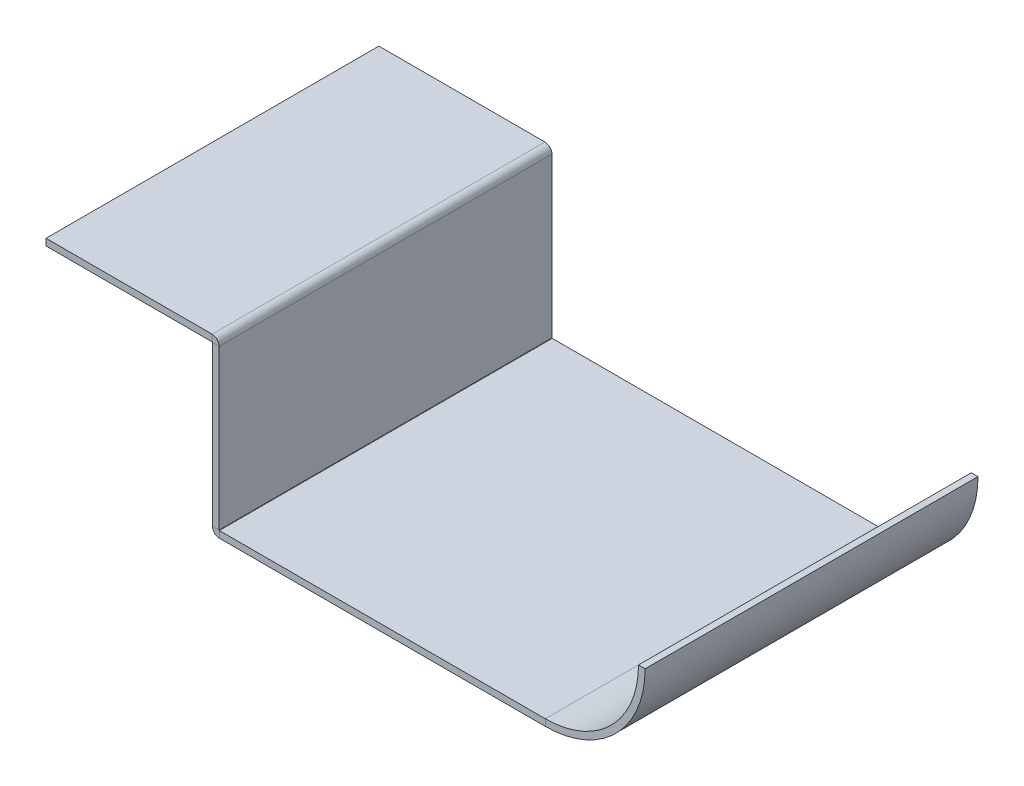
ISO-10303-21;
HEADER;
FILE_DESCRIPTION(('STEP AP214'),'2;1');
FILE_NAME('part.step','',(''),(''),'','','');
FILE_SCHEMA(('AUTOMOTIVE_DESIGN { 1 0 10303 214 1 1 1 1 }'));
ENDSEC;
DATA;
#1=APPLICATION_CONTEXT('core data for automotive mechanical design processes');
#2=APPLICATION_PROTOCOL_DEFINITION('international standard','automotive_design',2000,#1);
#3=PRODUCT_CONTEXT('',#1,'mechanical');
#4=PRODUCT('Part','Part','',(#3));
#5=PRODUCT_RELATED_PRODUCT_CATEGORY('part','',(#4));
#6=PRODUCT_DEFINITION_FORMATION('','',#4);
#7=PRODUCT_DEFINITION_CONTEXT('part definition',#1,'design');
#8=PRODUCT_DEFINITION('design','',#6,#7);
#9=PRODUCT_DEFINITION_SHAPE('','',#8);
#10=(LENGTH_UNIT() NAMED_UNIT(*) SI_UNIT(.MILLI.,.METRE.));
#11=(NAMED_UNIT(*) PLANE_ANGLE_UNIT() SI_UNIT($,.RADIAN.));
#12=(NAMED_UNIT(*) SI_UNIT($,.STERADIAN.) SOLID_ANGLE_UNIT());
#13=UNCERTAINTY_MEASURE_WITH_UNIT(LENGTH_MEASURE(1.E-05),#10,'distance_accuracy_value','');
#14=(GEOMETRIC_REPRESENTATION_CONTEXT(3) GLOBAL_UNCERTAINTY_ASSIGNED_CONTEXT((#13)) GLOBAL_UNIT_ASSIGNED_CONTEXT((#10,
#11,#12)) REPRESENTATION_CONTEXT('',''));
#15=CARTESIAN_POINT('',(0.,0.,0.));
#16=DIRECTION('',(0.,0.,1.));
#17=DIRECTION('',(1.,0.,0.));
#18=AXIS2_PLACEMENT_3D('',#15,#16,#17);
#19=CARTESIAN_POINT('',(100.,2.,-100.));
#20=DIRECTION('',(0.,0.,-1.));
#21=DIRECTION('',(-1.,0.,0.));
#22=AXIS2_PLACEMENT_3D('',#19,#20,#21);
#23=PLANE('',#22);
#24=DIRECTION('',(0.,-1.,0.));
#25=VECTOR('',#24,1.);
#26=CARTESIAN_POINT('',(100.,2.,-100.));
#27=LINE('',#26,#25);
#28=CARTESIAN_POINT('',(100.,2.,-100.));
#29=VERTEX_POINT('',#28);
#30=CARTESIAN_POINT('',(100.,0.,-100.));
#31=VERTEX_POINT('',#30);
#32=EDGE_CURVE('E11',#29,#31,#27,.T.);
#33=ORIENTED_EDGE('',*,*,#32,.F.);
#34=CARTESIAN_POINT('',(100.,30.,-100.));
#35=DIRECTION('',(0.,0.,1.));
#36=DIRECTION('',(1.,0.,0.));
#37=AXIS2_PLACEMENT_3D('',#34,#35,#36);
#38=CIRCLE('',#37,28.);
#39=CARTESIAN_POINT('',(128.,30.,-100.));
#40=VERTEX_POINT('',#39);
#41=EDGE_CURVE('E198',#40,#29,#38,.F.);
#42=ORIENTED_EDGE('',*,*,#41,.F.);
#43=DIRECTION('',(1.,0.,0.));
#44=VECTOR('',#43,1.);
#45=CARTESIAN_POINT('',(128.,30.,-100.));
#46=LINE('',#45,#44);
#47=CARTESIAN_POINT('',(130.,30.,-100.));
#48=VERTEX_POINT('',#47);
#49=EDGE_CURVE('E345',#40,#48,#46,.T.);
#50=ORIENTED_EDGE('',*,*,#49,.T.);
#51=CARTESIAN_POINT('',(100.,30.,-100.));
#52=DIRECTION('',(0.,0.,-1.));
#53=DIRECTION('',(1.,0.,0.));
#54=AXIS2_PLACEMENT_3D('',#51,#52,#53);
#55=CIRCLE('',#54,30.);
#56=EDGE_CURVE('E341',#48,#31,#55,.T.);
#57=ORIENTED_EDGE('',*,*,#56,.T.);
#58=EDGE_LOOP('',(#33,#42,#50,#57));
#59=FACE_BOUND('',#58,.T.);
#60=ADVANCED_FACE('F41',(#59),#23,.T.);
#61=CARTESIAN_POINT('',(100.,0.,0.));
#62=DIRECTION('',(0.,0.,1.));
#63=DIRECTION('',(1.,0.,0.));
#64=AXIS2_PLACEMENT_3D('',#61,#62,#63);
#65=PLANE('',#64);
#66=DIRECTION('',(0.,1.,0.));
#67=VECTOR('',#66,1.);
#68=CARTESIAN_POINT('',(100.,0.,0.));
#69=LINE('',#68,#67);
#70=CARTESIAN_POINT('',(100.,0.,0.));
#71=VERTEX_POINT('',#70);
#72=CARTESIAN_POINT('',(100.,2.,0.));
#73=VERTEX_POINT('',#72);
#74=EDGE_CURVE('E50',#71,#73,#69,.T.);
#75=ORIENTED_EDGE('',*,*,#74,.F.);
#76=CARTESIAN_POINT('',(100.,30.,0.));
#77=DIRECTION('',(0.,0.,-1.));
#78=DIRECTION('',(1.,0.,0.));
#79=AXIS2_PLACEMENT_3D('',#76,#77,#78);
#80=CIRCLE('',#79,30.);
#81=CARTESIAN_POINT('',(130.,30.,0.));
#82=VERTEX_POINT('',#81);
#83=EDGE_CURVE('E232',#82,#71,#80,.T.);
#84=ORIENTED_EDGE('',*,*,#83,.F.);
#85=DIRECTION('',(1.,0.,0.));
#86=VECTOR('',#85,1.);
#87=CARTESIAN_POINT('',(128.,30.,0.));
#88=LINE('',#87,#86);
#89=CARTESIAN_POINT('',(128.,30.,0.));
#90=VERTEX_POINT('',#89);
#91=EDGE_CURVE('E236',#90,#82,#88,.T.);
#92=ORIENTED_EDGE('',*,*,#91,.F.);
#93=CARTESIAN_POINT('',(100.,30.,0.));
#94=DIRECTION('',(0.,0.,1.));
#95=DIRECTION('',(1.,0.,0.));
#96=AXIS2_PLACEMENT_3D('',#93,#94,#95);
#97=CIRCLE('',#96,28.);
#98=EDGE_CURVE('E239',#90,#73,#97,.F.);
#99=ORIENTED_EDGE('',*,*,#98,.T.);
#100=EDGE_LOOP('',(#75,#84,#92,#99));
#101=FACE_BOUND('',#100,.T.);
#102=ADVANCED_FACE('F331',(#101),#65,.T.);
#103=CARTESIAN_POINT('',(2.1,0.,-100.));
#104=DIRECTION('',(0.,0.,-1.));
#105=DIRECTION('',(-1.,0.,0.));
#106=AXIS2_PLACEMENT_3D('',#103,#104,#105);
#107=PLANE('',#106);
#108=DIRECTION('',(0.,1.,0.));
#109=VECTOR('',#108,1.);
#110=CARTESIAN_POINT('',(2.1,0.,-100.));
#111=LINE('',#110,#109);
#112=CARTESIAN_POINT('',(2.1,0.,-100.));
#113=VERTEX_POINT('',#112);
#114=CARTESIAN_POINT('',(2.1,2.,-100.));
#115=VERTEX_POINT('',#114);
#116=EDGE_CURVE('E166',#113,#115,#111,.T.);
#117=ORIENTED_EDGE('',*,*,#116,.F.);
#118=CARTESIAN_POINT('',(2.1,2.1,-100.));
#119=DIRECTION('',(0.,0.,1.));
#120=DIRECTION('',(1.,0.,0.));
#121=AXIS2_PLACEMENT_3D('',#118,#119,#120);
#122=CIRCLE('',#121,2.1);
#123=CARTESIAN_POINT('',(0.,2.1,-100.));
#124=VERTEX_POINT('',#123);
#125=EDGE_CURVE('E160',#113,#124,#122,.F.);
#126=ORIENTED_EDGE('',*,*,#125,.T.);
#127=DIRECTION('',(-1.,0.,0.));
#128=VECTOR('',#127,1.);
#129=CARTESIAN_POINT('',(2.,2.1,-100.));
#130=LINE('',#129,#128);
#131=CARTESIAN_POINT('',(2.,2.1,-100.));
#132=VERTEX_POINT('',#131);
#133=EDGE_CURVE('E153',#132,#124,#130,.T.);
#134=ORIENTED_EDGE('',*,*,#133,.F.);
#135=CARTESIAN_POINT('',(2.1,2.1,-100.));
#136=DIRECTION('',(0.,0.,1.));
#137=DIRECTION('',(1.,0.,0.));
#138=AXIS2_PLACEMENT_3D('',#135,#136,#137);
#139=CIRCLE('',#138,0.0999999999999998);
#140=EDGE_CURVE('E157',#115,#132,#139,.F.);
#141=ORIENTED_EDGE('',*,*,#140,.F.);
#142=EDGE_LOOP('',(#117,#126,#134,#141));
#143=FACE_BOUND('',#142,.T.);
#144=ADVANCED_FACE('F155',(#143),#107,.T.);
#145=CARTESIAN_POINT('',(2.,2.1,-100.));
#146=DIRECTION('',(0.,0.,-1.));
#147=DIRECTION('',(-1.,0.,0.));
#148=AXIS2_PLACEMENT_3D('',#145,#146,#147);
#149=PLANE('',#148);
#150=DIRECTION('',(-1.,0.,0.));
#151=VECTOR('',#150,1.);
#152=CARTESIAN_POINT('',(0.,0.,-100.));
#153=LINE('',#152,#151);
#154=EDGE_CURVE('E346',#31,#113,#153,.T.);
#155=ORIENTED_EDGE('',*,*,#154,.T.);
#156=ORIENTED_EDGE('',*,*,#116,.T.);
#157=DIRECTION('',(1.,0.,0.));
#158=VECTOR('',#157,1.);
#159=CARTESIAN_POINT('',(0.,2.,-100.));
#160=LINE('',#159,#158);
#161=EDGE_CURVE('E195',#29,#115,#160,.F.);
#162=ORIENTED_EDGE('',*,*,#161,.F.);
#163=ORIENTED_EDGE('',*,*,#32,.T.);
#164=EDGE_LOOP('',(#155,#156,#162,#163));
#165=FACE_BOUND('',#164,.T.);
#166=ADVANCED_FACE('F409',(#165),#149,.T.);
#167=CARTESIAN_POINT('',(0.,2.1,0.));
#168=DIRECTION('',(0.,0.,1.));
#169=DIRECTION('',(1.,0.,0.));
#170=AXIS2_PLACEMENT_3D('',#167,#168,#169);
#171=PLANE('',#170);
#172=DIRECTION('',(1.,0.,0.));
#173=VECTOR('',#172,1.);
#174=CARTESIAN_POINT('',(0.,2.1,0.));
#175=LINE('',#174,#173);
#176=CARTESIAN_POINT('',(0.,2.1,0.));
#177=VERTEX_POINT('',#176);
#178=CARTESIAN_POINT('',(2.,2.1,0.));
#179=VERTEX_POINT('',#178);
#180=EDGE_CURVE('E167',#177,#179,#175,.T.);
#181=ORIENTED_EDGE('',*,*,#180,.F.);
#182=CARTESIAN_POINT('',(2.1,2.1,0.));
#183=DIRECTION('',(0.,0.,1.));
#184=DIRECTION('',(1.,0.,0.));
#185=AXIS2_PLACEMENT_3D('',#182,#183,#184);
#186=CIRCLE('',#185,2.1);
#187=CARTESIAN_POINT('',(2.1,0.,0.));
#188=VERTEX_POINT('',#187);
#189=EDGE_CURVE('E224',#188,#177,#186,.F.);
#190=ORIENTED_EDGE('',*,*,#189,.F.);
#191=DIRECTION('',(0.,-1.,0.));
#192=VECTOR('',#191,1.);
#193=CARTESIAN_POINT('',(2.1,2.,0.));
#194=LINE('',#193,#192);
#195=CARTESIAN_POINT('',(2.1,2.,0.));
#196=VERTEX_POINT('',#195);
#197=EDGE_CURVE('E308',#196,#188,#194,.T.);
#198=ORIENTED_EDGE('',*,*,#197,.F.);
#199=CARTESIAN_POINT('',(2.1,2.1,0.));
#200=DIRECTION('',(0.,0.,1.));
#201=DIRECTION('',(1.,0.,0.));
#202=AXIS2_PLACEMENT_3D('',#199,#200,#201);
#203=CIRCLE('',#202,0.0999999999999998);
#204=EDGE_CURVE('E247',#196,#179,#203,.F.);
#205=ORIENTED_EDGE('',*,*,#204,.T.);
#206=EDGE_LOOP('',(#181,#190,#198,#205));
#207=FACE_BOUND('',#206,.T.);
#208=ADVANCED_FACE('F419',(#207),#171,.T.);
#209=CARTESIAN_POINT('',(2.1,2.,0.));
#210=DIRECTION('',(0.,0.,1.));
#211=DIRECTION('',(1.,0.,0.));
#212=AXIS2_PLACEMENT_3D('',#209,#210,#211);
#213=PLANE('',#212);
#214=DIRECTION('',(0.,1.,0.));
#215=VECTOR('',#214,1.);
#216=CARTESIAN_POINT('',(0.,50.,0.));
#217=LINE('',#216,#215);
#218=CARTESIAN_POINT('',(0.,49.9,0.));
#219=VERTEX_POINT('',#218);
#220=EDGE_CURVE('E220',#177,#219,#217,.T.);
#221=ORIENTED_EDGE('',*,*,#220,.F.);
#222=ORIENTED_EDGE('',*,*,#180,.T.);
#223=DIRECTION('',(0.,1.,0.));
#224=VECTOR('',#223,1.);
#225=CARTESIAN_POINT('',(2.,50.,0.));
#226=LINE('',#225,#224);
#227=CARTESIAN_POINT('',(2.,49.9,0.));
#228=VERTEX_POINT('',#227);
#229=EDGE_CURVE('E177',#179,#228,#226,.T.);
#230=ORIENTED_EDGE('',*,*,#229,.T.);
#231=DIRECTION('',(-1.,0.,0.));
#232=VECTOR('',#231,1.);
#233=CARTESIAN_POINT('',(2.,49.9,0.));
#234=LINE('',#233,#232);
#235=EDGE_CURVE('E105',#228,#219,#234,.T.);
#236=ORIENTED_EDGE('',*,*,#235,.T.);
#237=EDGE_LOOP('',(#221,#222,#230,#236));
#238=FACE_BOUND('',#237,.T.);
#239=ADVANCED_FACE('F417',(#238),#213,.T.);
#240=CARTESIAN_POINT('',(0.,49.9,-100.));
#241=DIRECTION('',(0.,0.,-1.));
#242=DIRECTION('',(-1.,0.,0.));
#243=AXIS2_PLACEMENT_3D('',#240,#241,#242);
#244=PLANE('',#243);
#245=DIRECTION('',(1.,0.,0.));
#246=VECTOR('',#245,1.);
#247=CARTESIAN_POINT('',(0.,49.9,-100.));
#248=LINE('',#247,#246);
#249=CARTESIAN_POINT('',(0.,49.9,-100.));
#250=VERTEX_POINT('',#249);
#251=CARTESIAN_POINT('',(2.,49.9,-100.));
#252=VERTEX_POINT('',#251);
#253=EDGE_CURVE('E186',#250,#252,#248,.T.);
#254=ORIENTED_EDGE('',*,*,#253,.F.);
#255=CARTESIAN_POINT('',(-0.0999999999999987,49.9,-100.));
#256=DIRECTION('',(0.,0.,-1.));
#257=DIRECTION('',(-1.,0.,0.));
#258=AXIS2_PLACEMENT_3D('',#255,#256,#257);
#259=CIRCLE('',#258,0.1);
#260=CARTESIAN_POINT('',(-0.0999999999999987,50.,-100.));
#261=VERTEX_POINT('',#260);
#262=EDGE_CURVE('E360',#250,#261,#259,.F.);
#263=ORIENTED_EDGE('',*,*,#262,.T.);
#264=DIRECTION('',(0.,-1.,0.));
#265=VECTOR('',#264,1.);
#266=CARTESIAN_POINT('',(-0.099999999999999,52.,-100.));
#267=LINE('',#266,#265);
#268=CARTESIAN_POINT('',(-0.099999999999999,52.,-100.));
#269=VERTEX_POINT('',#268);
#270=EDGE_CURVE('E58',#269,#261,#267,.T.);
#271=ORIENTED_EDGE('',*,*,#270,.F.);
#272=CARTESIAN_POINT('',(-0.0999999999999987,49.9,-100.));
#273=DIRECTION('',(0.,0.,1.));
#274=DIRECTION('',(1.,0.,0.));
#275=AXIS2_PLACEMENT_3D('',#272,#273,#274);
#276=CIRCLE('',#275,2.1);
#277=EDGE_CURVE('E189',#252,#269,#276,.T.);
#278=ORIENTED_EDGE('',*,*,#277,.F.);
#279=EDGE_LOOP('',(#254,#263,#271,#278));
#280=FACE_BOUND('',#279,.T.);
#281=ADVANCED_FACE('F377',(#280),#244,.T.);
#282=CARTESIAN_POINT('',(-0.099999999999999,52.,-100.));
#283=DIRECTION('',(0.,0.,-1.));
#284=DIRECTION('',(-1.,0.,0.));
#285=AXIS2_PLACEMENT_3D('',#282,#283,#284);
#286=PLANE('',#285);
#287=DIRECTION('',(0.,1.,0.));
#288=VECTOR('',#287,1.);
#289=CARTESIAN_POINT('',(0.,50.,-100.));
#290=LINE('',#289,#288);
#291=EDGE_CURVE('E357',#124,#250,#290,.T.);
#292=ORIENTED_EDGE('',*,*,#291,.T.);
#293=ORIENTED_EDGE('',*,*,#253,.T.);
#294=DIRECTION('',(0.,1.,0.));
#295=VECTOR('',#294,1.);
#296=CARTESIAN_POINT('',(2.,50.,-100.));
#297=LINE('',#296,#295);
#298=EDGE_CURVE('E175',#132,#252,#297,.T.);
#299=ORIENTED_EDGE('',*,*,#298,.F.);
#300=ORIENTED_EDGE('',*,*,#133,.T.);
#301=EDGE_LOOP('',(#292,#293,#299,#300));
#302=FACE_BOUND('',#301,.T.);
#303=ADVANCED_FACE('F185',(#302),#286,.T.);
#304=CARTESIAN_POINT('',(-0.0999999999999987,50.,0.));
#305=DIRECTION('',(0.,0.,1.));
#306=DIRECTION('',(1.,0.,0.));
#307=AXIS2_PLACEMENT_3D('',#304,#305,#306);
#308=PLANE('',#307);
#309=DIRECTION('',(0.,1.,0.));
#310=VECTOR('',#309,1.);
#311=CARTESIAN_POINT('',(-0.0999999999999987,50.,0.));
#312=LINE('',#311,#310);
#313=CARTESIAN_POINT('',(-0.0999999999999987,50.,0.));
#314=VERTEX_POINT('',#313);
#315=CARTESIAN_POINT('',(-0.099999999999999,52.,0.));
#316=VERTEX_POINT('',#315);
#317=EDGE_CURVE('E112',#314,#316,#312,.T.);
#318=ORIENTED_EDGE('',*,*,#317,.F.);
#319=CARTESIAN_POINT('',(-0.0999999999999987,49.9,0.));
#320=DIRECTION('',(0.,0.,-1.));
#321=DIRECTION('',(-1.,0.,0.));
#322=AXIS2_PLACEMENT_3D('',#319,#320,#321);
#323=CIRCLE('',#322,0.1);
#324=EDGE_CURVE('E216',#219,#314,#323,.F.);
#325=ORIENTED_EDGE('',*,*,#324,.F.);
#326=ORIENTED_EDGE('',*,*,#235,.F.);
#327=CARTESIAN_POINT('',(-0.0999999999999987,49.9,0.));
#328=DIRECTION('',(0.,0.,1.));
#329=DIRECTION('',(1.,0.,0.));
#330=AXIS2_PLACEMENT_3D('',#327,#328,#329);
#331=CIRCLE('',#330,2.1);
#332=EDGE_CURVE('E252',#228,#316,#331,.T.);
#333=ORIENTED_EDGE('',*,*,#332,.T.);
#334=EDGE_LOOP('',(#318,#325,#326,#333));
#335=FACE_BOUND('',#334,.T.);
#336=ADVANCED_FACE('F395',(#335),#308,.T.);
#337=CARTESIAN_POINT('',(2.,49.9,0.));
#338=DIRECTION('',(0.,0.,1.));
#339=DIRECTION('',(1.,0.,0.));
#340=AXIS2_PLACEMENT_3D('',#337,#338,#339);
#341=PLANE('',#340);
#342=DIRECTION('',(-1.,0.,0.));
#343=VECTOR('',#342,1.);
#344=CARTESIAN_POINT('',(0.,50.,0.));
#345=LINE('',#344,#343);
#346=CARTESIAN_POINT('',(-50.,50.,0.));
#347=VERTEX_POINT('',#346);
#348=EDGE_CURVE('E213',#314,#347,#345,.T.);
#349=ORIENTED_EDGE('',*,*,#348,.F.);
#350=ORIENTED_EDGE('',*,*,#317,.T.);
#351=DIRECTION('',(-1.,0.,0.));
#352=VECTOR('',#351,1.);
#353=CARTESIAN_POINT('',(0.,52.,0.));
#354=LINE('',#353,#352);
#355=CARTESIAN_POINT('',(-50.,52.,0.));
#356=VERTEX_POINT('',#355);
#357=EDGE_CURVE('E206',#316,#356,#354,.T.);
#358=ORIENTED_EDGE('',*,*,#357,.T.);
#359=DIRECTION('',(0.,1.,0.));
#360=VECTOR('',#359,1.);
#361=CARTESIAN_POINT('',(-50.,50.,0.));
#362=LINE('',#361,#360);
#363=EDGE_CURVE('E209',#347,#356,#362,.T.);
#364=ORIENTED_EDGE('',*,*,#363,.F.);
#365=EDGE_LOOP('',(#349,#350,#358,#364));
#366=FACE_BOUND('',#365,.T.);
#367=ADVANCED_FACE('F394',(#366),#341,.T.);
#368=CARTESIAN_POINT('',(0.,52.,-100.));
#369=DIRECTION('',(0.,1.,0.));
#370=DIRECTION('',(-1.,0.,0.));
#371=AXIS2_PLACEMENT_3D('',#368,#369,#370);
#372=PLANE('',#371);
#373=ORIENTED_EDGE('',*,*,#357,.F.);
#374=DIRECTION('',(0.,0.,1.));
#375=VECTOR('',#374,1.);
#376=CARTESIAN_POINT('',(-0.099999999999999,52.,-100.));
#377=LINE('',#376,#375);
#378=EDGE_CURVE('E256',#269,#316,#377,.T.);
#379=ORIENTED_EDGE('',*,*,#378,.F.);
#380=DIRECTION('',(-1.,0.,0.));
#381=VECTOR('',#380,1.);
#382=CARTESIAN_POINT('',(0.,52.,-100.));
#383=LINE('',#382,#381);
#384=CARTESIAN_POINT('',(-50.,52.,-100.));
#385=VERTEX_POINT('',#384);
#386=EDGE_CURVE('E255',#269,#385,#383,.T.);
#387=ORIENTED_EDGE('',*,*,#386,.T.);
#388=DIRECTION('',(0.,0.,1.));
#389=VECTOR('',#388,1.);
#390=CARTESIAN_POINT('',(-50.,52.,-100.));
#391=LINE('',#390,#389);
#392=EDGE_CURVE('E205',#385,#356,#391,.T.);
#393=ORIENTED_EDGE('',*,*,#392,.T.);
#394=EDGE_LOOP('',(#373,#379,#387,#393));
#395=FACE_BOUND('',#394,.T.);
#396=ADVANCED_FACE('F372',(#395),#372,.T.);
#397=CARTESIAN_POINT('',(-0.0999999999999987,49.9,-100.));
#398=DIRECTION('',(0.,0.,1.));
#399=DIRECTION('',(1.,0.,0.));
#400=AXIS2_PLACEMENT_3D('',#397,#398,#399);
#401=CYLINDRICAL_SURFACE('',#400,2.1);
#402=ORIENTED_EDGE('',*,*,#332,.F.);
#403=DIRECTION('',(0.,0.,1.));
#404=VECTOR('',#403,1.);
#405=CARTESIAN_POINT('',(2.,49.9,-100.));
#406=LINE('',#405,#404);
#407=EDGE_CURVE('E182',#252,#228,#406,.T.);
#408=ORIENTED_EDGE('',*,*,#407,.F.);
#409=ORIENTED_EDGE('',*,*,#277,.T.);
#410=ORIENTED_EDGE('',*,*,#378,.T.);
#411=EDGE_LOOP('',(#402,#408,#409,#410));
#412=FACE_BOUND('',#411,.T.);
#413=ADVANCED_FACE('F376',(#412),#401,.T.);
#414=CARTESIAN_POINT('',(2.,50.,-100.));
#415=DIRECTION('',(1.,0.,0.));
#416=DIRECTION('',(0.,1.,0.));
#417=AXIS2_PLACEMENT_3D('',#414,#415,#416);
#418=PLANE('',#417);
#419=ORIENTED_EDGE('',*,*,#229,.F.);
#420=DIRECTION('',(0.,0.,1.));
#421=VECTOR('',#420,1.);
#422=CARTESIAN_POINT('',(2.,2.1,-100.));
#423=LINE('',#422,#421);
#424=EDGE_CURVE('E173',#132,#179,#423,.T.);
#425=ORIENTED_EDGE('',*,*,#424,.F.);
#426=ORIENTED_EDGE('',*,*,#298,.T.);
#427=ORIENTED_EDGE('',*,*,#407,.T.);
#428=EDGE_LOOP('',(#419,#425,#426,#427));
#429=FACE_BOUND('',#428,.T.);
#430=ADVANCED_FACE('F174',(#429),#418,.T.);
#431=CARTESIAN_POINT('',(2.1,2.1,-100.));
#432=DIRECTION('',(0.,0.,1.));
#433=DIRECTION('',(1.,0.,0.));
#434=AXIS2_PLACEMENT_3D('',#431,#432,#433);
#435=CYLINDRICAL_SURFACE('',#434,0.0999999999999998);
#436=ORIENTED_EDGE('',*,*,#204,.F.);
#437=DIRECTION('',(0.,0.,1.));
#438=VECTOR('',#437,1.);
#439=CARTESIAN_POINT('',(2.1,2.,-100.));
#440=LINE('',#439,#438);
#441=EDGE_CURVE('E183',#115,#196,#440,.T.);
#442=ORIENTED_EDGE('',*,*,#441,.F.);
#443=ORIENTED_EDGE('',*,*,#140,.T.);
#444=ORIENTED_EDGE('',*,*,#424,.T.);
#445=EDGE_LOOP('',(#436,#442,#443,#444));
#446=FACE_BOUND('',#445,.T.);
#447=ADVANCED_FACE('F192',(#446),#435,.F.);
#448=CARTESIAN_POINT('',(0.,2.,-100.));
#449=DIRECTION('',(0.,1.,0.));
#450=DIRECTION('',(0.,0.,1.));
#451=AXIS2_PLACEMENT_3D('',#448,#449,#450);
#452=PLANE('',#451);
#453=DIRECTION('',(1.,0.,0.));
#454=VECTOR('',#453,1.);
#455=CARTESIAN_POINT('',(0.,2.,0.));
#456=LINE('',#455,#454);
#457=EDGE_CURVE('E243',#73,#196,#456,.F.);
#458=ORIENTED_EDGE('',*,*,#457,.F.);
#459=DIRECTION('',(0.,0.,1.));
#460=VECTOR('',#459,1.);
#461=CARTESIAN_POINT('',(100.,2.,-100.));
#462=LINE('',#461,#460);
#463=EDGE_CURVE('E263',#29,#73,#462,.T.);
#464=ORIENTED_EDGE('',*,*,#463,.F.);
#465=ORIENTED_EDGE('',*,*,#161,.T.);
#466=ORIENTED_EDGE('',*,*,#441,.T.);
#467=EDGE_LOOP('',(#458,#464,#465,#466));
#468=FACE_BOUND('',#467,.T.);
#469=ADVANCED_FACE('F329',(#468),#452,.T.);
#470=CARTESIAN_POINT('',(100.,30.,-100.));
#471=DIRECTION('',(0.,0.,1.));
#472=DIRECTION('',(1.,0.,0.));
#473=AXIS2_PLACEMENT_3D('',#470,#471,#472);
#474=CYLINDRICAL_SURFACE('',#473,28.);
#475=ORIENTED_EDGE('',*,*,#98,.F.);
#476=DIRECTION('',(0.,0.,1.));
#477=VECTOR('',#476,1.);
#478=CARTESIAN_POINT('',(128.,30.,-100.));
#479=LINE('',#478,#477);
#480=EDGE_CURVE('E267',#40,#90,#479,.T.);
#481=ORIENTED_EDGE('',*,*,#480,.F.);
#482=ORIENTED_EDGE('',*,*,#41,.T.);
#483=ORIENTED_EDGE('',*,*,#463,.T.);
#484=EDGE_LOOP('',(#475,#481,#482,#483));
#485=FACE_BOUND('',#484,.T.);
#486=ADVANCED_FACE('F325',(#485),#474,.F.);
#487=CARTESIAN_POINT('',(128.,30.,-100.));
#488=DIRECTION('',(0.,-1.,0.));
#489=DIRECTION('',(0.,0.,-1.));
#490=AXIS2_PLACEMENT_3D('',#487,#488,#489);
#491=PLANE('',#490);
#492=ORIENTED_EDGE('',*,*,#91,.T.);
#493=DIRECTION('',(0.,0.,1.));
#494=VECTOR('',#493,1.);
#495=CARTESIAN_POINT('',(130.,30.,-100.));
#496=LINE('',#495,#494);
#497=EDGE_CURVE('E270',#48,#82,#496,.T.);
#498=ORIENTED_EDGE('',*,*,#497,.F.);
#499=ORIENTED_EDGE('',*,*,#49,.F.);
#500=ORIENTED_EDGE('',*,*,#480,.T.);
#501=EDGE_LOOP('',(#492,#498,#499,#500));
#502=FACE_BOUND('',#501,.T.);
#503=ADVANCED_FACE('F334',(#502),#491,.F.);
#504=CARTESIAN_POINT('',(100.,30.,-100.));
#505=DIRECTION('',(0.,0.,1.));
#506=DIRECTION('',(1.,0.,0.));
#507=AXIS2_PLACEMENT_3D('',#504,#505,#506);
#508=CYLINDRICAL_SURFACE('',#507,30.);
#509=ORIENTED_EDGE('',*,*,#83,.T.);
#510=DIRECTION('',(0.,0.,1.));
#511=VECTOR('',#510,1.);
#512=CARTESIAN_POINT('',(100.,0.,-100.));
#513=LINE('',#512,#511);
#514=EDGE_CURVE('E274',#31,#71,#513,.T.);
#515=ORIENTED_EDGE('',*,*,#514,.F.);
#516=ORIENTED_EDGE('',*,*,#56,.F.);
#517=ORIENTED_EDGE('',*,*,#497,.T.);
#518=EDGE_LOOP('',(#509,#515,#516,#517));
#519=FACE_BOUND('',#518,.T.);
#520=ADVANCED_FACE('F338',(#519),#508,.T.);
#521=CARTESIAN_POINT('',(0.,0.,-100.));
#522=DIRECTION('',(0.,1.,0.));
#523=DIRECTION('',(0.,0.,1.));
#524=AXIS2_PLACEMENT_3D('',#521,#522,#523);
#525=PLANE('',#524);
#526=DIRECTION('',(-1.,0.,0.));
#527=VECTOR('',#526,1.);
#528=CARTESIAN_POINT('',(0.,0.,0.));
#529=LINE('',#528,#527);
#530=EDGE_CURVE('E228',#71,#188,#529,.T.);
#531=ORIENTED_EDGE('',*,*,#530,.T.);
#532=DIRECTION('',(0.,0.,1.));
#533=VECTOR('',#532,1.);
#534=CARTESIAN_POINT('',(2.1,0.,-100.));
#535=LINE('',#534,#533);
#536=EDGE_CURVE('E278',#113,#188,#535,.T.);
#537=ORIENTED_EDGE('',*,*,#536,.F.);
#538=ORIENTED_EDGE('',*,*,#154,.F.);
#539=ORIENTED_EDGE('',*,*,#514,.T.);
#540=EDGE_LOOP('',(#531,#537,#538,#539));
#541=FACE_BOUND('',#540,.T.);
#542=ADVANCED_FACE('F412',(#541),#525,.F.);
#543=CARTESIAN_POINT('',(2.1,2.1,-100.));
#544=DIRECTION('',(0.,0.,1.));
#545=DIRECTION('',(1.,0.,0.));
#546=AXIS2_PLACEMENT_3D('',#543,#544,#545);
#547=CYLINDRICAL_SURFACE('',#546,2.1);
#548=ORIENTED_EDGE('',*,*,#189,.T.);
#549=DIRECTION('',(0.,0.,1.));
#550=VECTOR('',#549,1.);
#551=CARTESIAN_POINT('',(0.,2.1,-100.));
#552=LINE('',#551,#550);
#553=EDGE_CURVE('E282',#124,#177,#552,.T.);
#554=ORIENTED_EDGE('',*,*,#553,.F.);
#555=ORIENTED_EDGE('',*,*,#125,.F.);
#556=ORIENTED_EDGE('',*,*,#536,.T.);
#557=EDGE_LOOP('',(#548,#554,#555,#556));
#558=FACE_BOUND('',#557,.T.);
#559=ADVANCED_FACE('F415',(#558),#547,.T.);
#560=CARTESIAN_POINT('',(0.,50.,-100.));
#561=DIRECTION('',(1.,0.,0.));
#562=DIRECTION('',(0.,1.,0.));
#563=AXIS2_PLACEMENT_3D('',#560,#561,#562);
#564=PLANE('',#563);
#565=ORIENTED_EDGE('',*,*,#220,.T.);
#566=DIRECTION('',(0.,0.,1.));
#567=VECTOR('',#566,1.);
#568=CARTESIAN_POINT('',(0.,49.9,-100.));
#569=LINE('',#568,#567);
#570=EDGE_CURVE('E286',#250,#219,#569,.T.);
#571=ORIENTED_EDGE('',*,*,#570,.F.);
#572=ORIENTED_EDGE('',*,*,#291,.F.);
#573=ORIENTED_EDGE('',*,*,#553,.T.);
#574=EDGE_LOOP('',(#565,#571,#572,#573));
#575=FACE_BOUND('',#574,.T.);
#576=ADVANCED_FACE('F383',(#575),#564,.F.);
#577=CARTESIAN_POINT('',(-0.0999999999999987,49.9,-100.));
#578=DIRECTION('',(0.,0.,1.));
#579=DIRECTION('',(1.,0.,0.));
#580=AXIS2_PLACEMENT_3D('',#577,#578,#579);
#581=CYLINDRICAL_SURFACE('',#580,0.1);
#582=ORIENTED_EDGE('',*,*,#324,.T.);
#583=DIRECTION('',(0.,0.,1.));
#584=VECTOR('',#583,1.);
#585=CARTESIAN_POINT('',(-0.0999999999999987,50.,-100.));
#586=LINE('',#585,#584);
#587=EDGE_CURVE('E290',#261,#314,#586,.T.);
#588=ORIENTED_EDGE('',*,*,#587,.F.);
#589=ORIENTED_EDGE('',*,*,#262,.F.);
#590=ORIENTED_EDGE('',*,*,#570,.T.);
#591=EDGE_LOOP('',(#582,#588,#589,#590));
#592=FACE_BOUND('',#591,.T.);
#593=ADVANCED_FACE('F386',(#592),#581,.F.);
#594=CARTESIAN_POINT('',(0.,50.,-100.));
#595=DIRECTION('',(0.,1.,0.));
#596=DIRECTION('',(-1.,0.,0.));
#597=AXIS2_PLACEMENT_3D('',#594,#595,#596);
#598=PLANE('',#597);
#599=ORIENTED_EDGE('',*,*,#348,.T.);
#600=DIRECTION('',(0.,0.,1.));
#601=VECTOR('',#600,1.);
#602=CARTESIAN_POINT('',(-50.,50.,-100.));
#603=LINE('',#602,#601);
#604=CARTESIAN_POINT('',(-50.,50.,-100.));
#605=VERTEX_POINT('',#604);
#606=EDGE_CURVE('E294',#605,#347,#603,.T.);
#607=ORIENTED_EDGE('',*,*,#606,.F.);
#608=DIRECTION('',(-1.,0.,0.));
#609=VECTOR('',#608,1.);
#610=CARTESIAN_POINT('',(0.,50.,-100.));
#611=LINE('',#610,#609);
#612=EDGE_CURVE('E363',#261,#605,#611,.T.);
#613=ORIENTED_EDGE('',*,*,#612,.F.);
#614=ORIENTED_EDGE('',*,*,#587,.T.);
#615=EDGE_LOOP('',(#599,#607,#613,#614));
#616=FACE_BOUND('',#615,.T.);
#617=ADVANCED_FACE('F390',(#616),#598,.F.);
#618=CARTESIAN_POINT('',(-50.,50.,-100.));
#619=DIRECTION('',(1.,0.,0.));
#620=DIRECTION('',(0.,0.,-1.));
#621=AXIS2_PLACEMENT_3D('',#618,#619,#620);
#622=PLANE('',#621);
#623=ORIENTED_EDGE('',*,*,#363,.T.);
#624=ORIENTED_EDGE('',*,*,#392,.F.);
#625=DIRECTION('',(0.,1.,0.));
#626=VECTOR('',#625,1.);
#627=CARTESIAN_POINT('',(-50.,50.,-100.));
#628=LINE('',#627,#626);
#629=EDGE_CURVE('E121',#605,#385,#628,.T.);
#630=ORIENTED_EDGE('',*,*,#629,.F.);
#631=ORIENTED_EDGE('',*,*,#606,.T.);
#632=EDGE_LOOP('',(#623,#624,#630,#631));
#633=FACE_BOUND('',#632,.T.);
#634=ADVANCED_FACE('F393',(#633),#622,.F.);
#635=CARTESIAN_POINT('',(-0.0999999999999987,49.9,-100.));
#636=DIRECTION('',(0.,0.,-1.));
#637=DIRECTION('',(-1.,0.,0.));
#638=AXIS2_PLACEMENT_3D('',#635,#636,#637);
#639=PLANE('',#638);
#640=ORIENTED_EDGE('',*,*,#386,.F.);
#641=ORIENTED_EDGE('',*,*,#270,.T.);
#642=ORIENTED_EDGE('',*,*,#612,.T.);
#643=ORIENTED_EDGE('',*,*,#629,.T.);
#644=EDGE_LOOP('',(#640,#641,#642,#643));
#645=FACE_BOUND('',#644,.T.);
#646=ADVANCED_FACE('F373',(#645),#639,.T.);
#647=CARTESIAN_POINT('',(-0.0999999999999987,49.9,0.));
#648=DIRECTION('',(0.,0.,-1.));
#649=DIRECTION('',(-1.,0.,0.));
#650=AXIS2_PLACEMENT_3D('',#647,#648,#649);
#651=PLANE('',#650);
#652=ORIENTED_EDGE('',*,*,#457,.T.);
#653=ORIENTED_EDGE('',*,*,#197,.T.);
#654=ORIENTED_EDGE('',*,*,#530,.F.);
#655=ORIENTED_EDGE('',*,*,#74,.T.);
#656=EDGE_LOOP('',(#652,#653,#654,#655));
#657=FACE_BOUND('',#656,.T.);
#658=ADVANCED_FACE('F317',(#657),#651,.F.);
#659=CLOSED_SHELL('',(#60,#102,#144,#166,#208,#239,#281,#303,#336,#367,#396,#413,#430,#447,#469,
#486,#503,#520,#542,#559,#576,#593,#617,#634,#646,#658));
#660=MANIFOLD_SOLID_BREP('B2',#659);
#661=ADVANCED_BREP_SHAPE_REPRESENTATION('',(#18,#660),#14);
#662=SHAPE_DEFINITION_REPRESENTATION(#9,#661);
ENDSEC;
END-ISO-10303-21;
